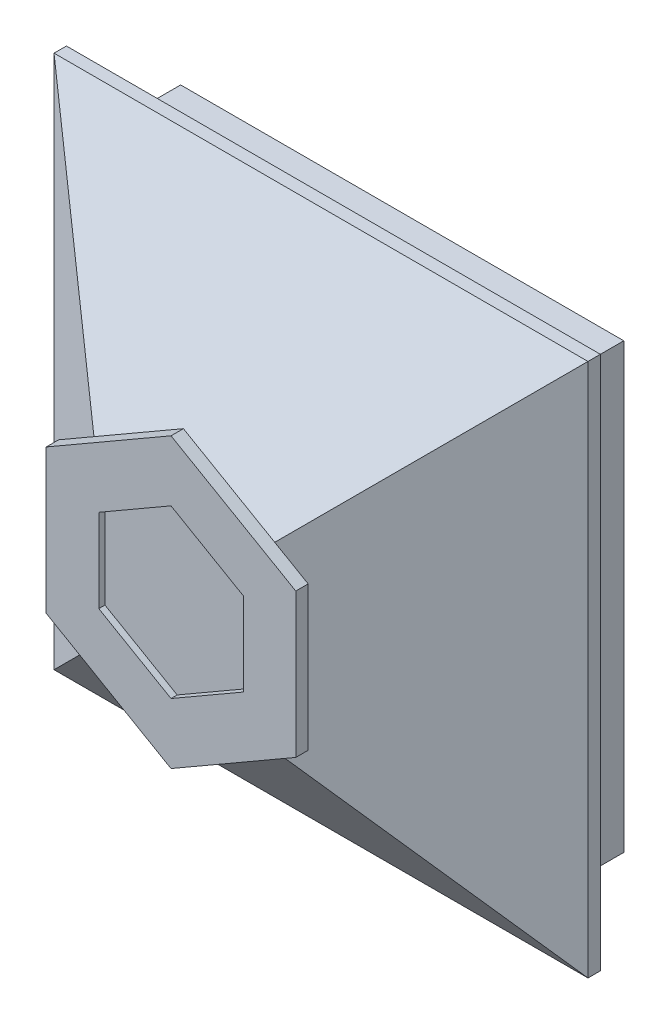
ISO-10303-21;
HEADER;
FILE_DESCRIPTION(('STEP AP214'),'2;1');
FILE_NAME('part.step','',(''),(''),'','','');
FILE_SCHEMA(('AUTOMOTIVE_DESIGN { 1 0 10303 214 1 1 1 1 }'));
ENDSEC;
DATA;
#1=APPLICATION_CONTEXT('core data for automotive mechanical design processes');
#2=APPLICATION_PROTOCOL_DEFINITION('international standard','automotive_design',2000,#1);
#3=PRODUCT_CONTEXT('',#1,'mechanical');
#4=PRODUCT('Part','Part','',(#3));
#5=PRODUCT_RELATED_PRODUCT_CATEGORY('part','',(#4));
#6=PRODUCT_DEFINITION_FORMATION('','',#4);
#7=PRODUCT_DEFINITION_CONTEXT('part definition',#1,'design');
#8=PRODUCT_DEFINITION('design','',#6,#7);
#9=PRODUCT_DEFINITION_SHAPE('','',#8);
#10=(LENGTH_UNIT() NAMED_UNIT(*) SI_UNIT(.MILLI.,.METRE.));
#11=(NAMED_UNIT(*) PLANE_ANGLE_UNIT() SI_UNIT($,.RADIAN.));
#12=(NAMED_UNIT(*) SI_UNIT($,.STERADIAN.) SOLID_ANGLE_UNIT());
#13=UNCERTAINTY_MEASURE_WITH_UNIT(LENGTH_MEASURE(1.E-05),#10,'distance_accuracy_value','');
#14=(GEOMETRIC_REPRESENTATION_CONTEXT(3) GLOBAL_UNCERTAINTY_ASSIGNED_CONTEXT((#13)) GLOBAL_UNIT_ASSIGNED_CONTEXT((#10,
#11,#12)) REPRESENTATION_CONTEXT('',''));
#15=CARTESIAN_POINT('',(0.,0.,0.));
#16=DIRECTION('',(0.,0.,1.));
#17=DIRECTION('',(1.,0.,0.));
#18=AXIS2_PLACEMENT_3D('',#15,#16,#17);
#19=CARTESIAN_POINT('',(0.,0.,31.8));
#20=DIRECTION('',(0.,0.,1.));
#21=DIRECTION('',(1.,0.,0.));
#22=AXIS2_PLACEMENT_3D('',#19,#20,#21);
#23=PLANE('',#22);
#24=DIRECTION('',(-0.866025403784441,0.499999999999995,0.));
#25=VECTOR('',#24,1.);
#26=CARTESIAN_POINT('',(-51.5011473021286,15.8638698337392,31.8));
#27=LINE('',#26,#25);
#28=CARTESIAN_POINT('',(-51.5011473021286,15.8638698337392,31.8));
#29=VERTEX_POINT('',#28);
#30=CARTESIAN_POINT('',(-69.6349675631671,26.3334358428859,31.8));
#31=VERTEX_POINT('',#30);
#32=EDGE_CURVE('E361',#29,#31,#27,.T.);
#33=ORIENTED_EDGE('',*,*,#32,.F.);
#34=DIRECTION('',(0.,1.,0.));
#35=VECTOR('',#34,1.);
#36=CARTESIAN_POINT('',(-51.5011473021284,-5.07526218455475,31.8));
#37=LINE('',#36,#35);
#38=CARTESIAN_POINT('',(-51.5011473021284,-5.07526218455475,31.8));
#39=VERTEX_POINT('',#38);
#40=EDGE_CURVE('E391',#39,#29,#37,.T.);
#41=ORIENTED_EDGE('',*,*,#40,.F.);
#42=DIRECTION('',(0.866025403784434,0.500000000000007,0.));
#43=VECTOR('',#42,1.);
#44=CARTESIAN_POINT('',(-69.634967563167,-15.5448281937019,31.8));
#45=LINE('',#44,#43);
#46=CARTESIAN_POINT('',(-69.634967563167,-15.5448281937019,31.8));
#47=VERTEX_POINT('',#46);
#48=EDGE_CURVE('E410',#47,#39,#45,.T.);
#49=ORIENTED_EDGE('',*,*,#48,.F.);
#50=DIRECTION('',(0.866025403784441,-0.499999999999995,0.));
#51=VECTOR('',#50,1.);
#52=CARTESIAN_POINT('',(-87.7687878242057,-5.075262184555,31.8));
#53=LINE('',#52,#51);
#54=CARTESIAN_POINT('',(-87.7687878242057,-5.075262184555,31.8));
#55=VERTEX_POINT('',#54);
#56=EDGE_CURVE('E408',#55,#47,#53,.T.);
#57=ORIENTED_EDGE('',*,*,#56,.F.);
#58=DIRECTION('',(0.,-1.,0.));
#59=VECTOR('',#58,1.);
#60=CARTESIAN_POINT('',(-87.7687878242058,15.8638698337389,31.8));
#61=LINE('',#60,#59);
#62=CARTESIAN_POINT('',(-87.7687878242058,15.8638698337389,31.8));
#63=VERTEX_POINT('',#62);
#64=EDGE_CURVE('E406',#63,#55,#61,.T.);
#65=ORIENTED_EDGE('',*,*,#64,.F.);
#66=DIRECTION('',(-0.866025403784438,-0.500000000000001,0.));
#67=VECTOR('',#66,1.);
#68=CARTESIAN_POINT('',(-69.6349675631671,26.3334358428859,31.8));
#69=LINE('',#68,#67);
#70=EDGE_CURVE('E404',#31,#63,#69,.T.);
#71=ORIENTED_EDGE('',*,*,#70,.F.);
#72=EDGE_LOOP('',(#33,#41,#49,#57,#65,#71));
#73=FACE_BOUND('',#72,.T.);
#74=DIRECTION('',(1.,0.,0.));
#75=VECTOR('',#74,1.);
#76=CARTESIAN_POINT('',(-108.434967563167,-7.53902950874128,31.8));
#77=LINE('',#76,#75);
#78=CARTESIAN_POINT('',(-82.5683008965004,-7.53902950874128,31.8));
#79=VERTEX_POINT('',#78);
#80=CARTESIAN_POINT('',(-56.7016342298339,-7.53902950874141,31.8));
#81=VERTEX_POINT('',#80);
#82=EDGE_CURVE('E440',#79,#81,#77,.T.);
#83=ORIENTED_EDGE('',*,*,#82,.T.);
#84=DIRECTION('',(0.,1.,0.));
#85=VECTOR('',#84,1.);
#86=CARTESIAN_POINT('',(-56.7016342298341,-33.4056961754081,31.8));
#87=LINE('',#86,#85);
#88=CARTESIAN_POINT('',(-56.7016342298336,18.3276371579253,31.8));
#89=VERTEX_POINT('',#88);
#90=EDGE_CURVE('E287',#81,#89,#87,.T.);
#91=ORIENTED_EDGE('',*,*,#90,.T.);
#92=DIRECTION('',(-1.,0.,0.));
#93=VECTOR('',#92,1.);
#94=CARTESIAN_POINT('',(-30.8349675631671,18.3276371579254,31.8));
#95=LINE('',#94,#93);
#96=CARTESIAN_POINT('',(-82.5683008965004,18.3276371579254,31.8));
#97=VERTEX_POINT('',#96);
#98=EDGE_CURVE('E316',#89,#97,#95,.T.);
#99=ORIENTED_EDGE('',*,*,#98,.T.);
#100=DIRECTION('',(0.,-1.,0.));
#101=VECTOR('',#100,1.);
#102=CARTESIAN_POINT('',(-82.5683008965003,44.1943038245921,31.8));
#103=LINE('',#102,#101);
#104=EDGE_CURVE('E353',#97,#79,#103,.T.);
#105=ORIENTED_EDGE('',*,*,#104,.T.);
#106=EDGE_LOOP('',(#83,#91,#99,#105));
#107=FACE_BOUND('',#106,.T.);
#108=ADVANCED_FACE('F33',(#73,#107),#23,.F.);
#109=CARTESIAN_POINT('',(-108.434967563167,-33.4056961754079,11.8));
#110=DIRECTION('',(0.,-0.611679591215394,0.791105604638577));
#111=DIRECTION('',(0.,-0.791105604638577,-0.611679591215394));
#112=AXIS2_PLACEMENT_3D('',#109,#110,#111);
#113=PLANE('',#112);
#114=ORIENTED_EDGE('',*,*,#82,.F.);
#115=DIRECTION('',(-0.620432415823373,-0.620432415823373,-0.479715785430443));
#116=VECTOR('',#115,1.);
#117=CARTESIAN_POINT('',(-108.434967563167,-33.4056961754079,11.8));
#118=LINE('',#117,#116);
#119=CARTESIAN_POINT('',(-108.434967563167,-33.4056961754079,11.8));
#120=VERTEX_POINT('',#119);
#121=EDGE_CURVE('E437',#79,#120,#118,.T.);
#122=ORIENTED_EDGE('',*,*,#121,.T.);
#123=DIRECTION('',(1.,0.,0.));
#124=VECTOR('',#123,1.);
#125=CARTESIAN_POINT('',(-108.434967563167,-33.4056961754079,11.8));
#126=LINE('',#125,#124);
#127=CARTESIAN_POINT('',(-30.8349675631675,-33.4056961754083,11.8));
#128=VERTEX_POINT('',#127);
#129=EDGE_CURVE('E448',#120,#128,#126,.T.);
#130=ORIENTED_EDGE('',*,*,#129,.T.);
#131=DIRECTION('',(-0.620432415823373,0.620432415823373,0.479715785430443));
#132=VECTOR('',#131,1.);
#133=CARTESIAN_POINT('',(-60.7060308532706,-3.53463288530443,34.8961829562656));
#134=LINE('',#133,#132);
#135=EDGE_CURVE('E433',#128,#81,#134,.T.);
#136=ORIENTED_EDGE('',*,*,#135,.T.);
#137=EDGE_LOOP('',(#114,#122,#130,#136));
#138=FACE_BOUND('',#137,.T.);
#139=ADVANCED_FACE('F509',(#138),#113,.T.);
#140=CARTESIAN_POINT('',(-108.434967563167,-30.4629790636216,11.8));
#141=DIRECTION('',(0.,0.611679591215394,-0.791105604638576));
#142=DIRECTION('',(0.,0.791105604638577,0.611679591215395));
#143=AXIS2_PLACEMENT_3D('',#140,#141,#142);
#144=PLANE('',#143);
#145=DIRECTION('',(1.,0.,0.));
#146=VECTOR('',#145,1.);
#147=CARTESIAN_POINT('',(-108.434967563167,-30.4629790636216,11.8));
#148=LINE('',#147,#146);
#149=CARTESIAN_POINT('',(-105.492250451381,-30.4629790636216,11.8));
#150=VERTEX_POINT('',#149);
#151=CARTESIAN_POINT('',(-33.7776846749538,-30.462979063622,11.8));
#152=VERTEX_POINT('',#151);
#153=EDGE_CURVE('E11',#150,#152,#148,.T.);
#154=ORIENTED_EDGE('',*,*,#153,.F.);
#155=DIRECTION('',(0.620432415823373,0.620432415823373,0.479715785430443));
#156=VECTOR('',#155,1.);
#157=CARTESIAN_POINT('',(-106.62500933142,-31.5957379436608,10.9241555051244));
#158=LINE('',#157,#156);
#159=CARTESIAN_POINT('',(-79.6255837847141,-4.59631239695497,31.8));
#160=VERTEX_POINT('',#159);
#161=EDGE_CURVE('E57',#150,#160,#158,.T.);
#162=ORIENTED_EDGE('',*,*,#161,.T.);
#163=DIRECTION('',(1.,0.,0.));
#164=VECTOR('',#163,1.);
#165=CARTESIAN_POINT('',(-108.434967563167,-4.59631239695497,31.8));
#166=LINE('',#165,#164);
#167=CARTESIAN_POINT('',(-59.6443513416202,-4.59631239695507,31.8));
#168=VERTEX_POINT('',#167);
#169=EDGE_CURVE('E439',#160,#168,#166,.T.);
#170=ORIENTED_EDGE('',*,*,#169,.T.);
#171=DIRECTION('',(0.620432415823373,-0.620432415823373,-0.479715785430443));
#172=VECTOR('',#171,1.);
#173=CARTESIAN_POINT('',(-62.5159890850177,-1.72467465355729,34.02033846139));
#174=LINE('',#173,#172);
#175=EDGE_CURVE('E430',#168,#152,#174,.T.);
#176=ORIENTED_EDGE('',*,*,#175,.T.);
#177=EDGE_LOOP('',(#154,#162,#170,#176));
#178=FACE_BOUND('',#177,.T.);
#179=ADVANCED_FACE('F516',(#178),#144,.T.);
#180=CARTESIAN_POINT('',(0.,0.,11.8));
#181=DIRECTION('',(0.,0.,1.));
#182=DIRECTION('',(1.,0.,0.));
#183=AXIS2_PLACEMENT_3D('',#180,#181,#182);
#184=PLANE('',#183);
#185=DIRECTION('',(0.,-1.,0.));
#186=VECTOR('',#185,1.);
#187=CARTESIAN_POINT('',(-39.2349675631674,-25.0056961754083,11.8));
#188=LINE('',#187,#186);
#189=CARTESIAN_POINT('',(-39.2349675631668,35.7943038245918,11.8));
#190=VERTEX_POINT('',#189);
#191=CARTESIAN_POINT('',(-39.2349675631674,-25.0056961754083,11.8));
#192=VERTEX_POINT('',#191);
#193=EDGE_CURVE('E297',#190,#192,#188,.T.);
#194=ORIENTED_EDGE('',*,*,#193,.T.);
#195=DIRECTION('',(-1.,0.,0.));
#196=VECTOR('',#195,1.);
#197=CARTESIAN_POINT('',(-100.034967563167,-25.0056961754079,11.8));
#198=LINE('',#197,#196);
#199=CARTESIAN_POINT('',(-100.034967563167,-25.0056961754079,11.8));
#200=VERTEX_POINT('',#199);
#201=EDGE_CURVE('E445',#192,#200,#198,.T.);
#202=ORIENTED_EDGE('',*,*,#201,.T.);
#203=DIRECTION('',(0.,1.,0.));
#204=VECTOR('',#203,1.);
#205=CARTESIAN_POINT('',(-100.034967563167,35.7943038245922,11.8));
#206=LINE('',#205,#204);
#207=CARTESIAN_POINT('',(-100.034967563167,35.7943038245921,11.8));
#208=VERTEX_POINT('',#207);
#209=EDGE_CURVE('E363',#200,#208,#206,.T.);
#210=ORIENTED_EDGE('',*,*,#209,.T.);
#211=DIRECTION('',(1.,0.,0.));
#212=VECTOR('',#211,1.);
#213=CARTESIAN_POINT('',(-39.2349675631671,35.7943038245921,11.8));
#214=LINE('',#213,#212);
#215=EDGE_CURVE('E326',#208,#190,#214,.T.);
#216=ORIENTED_EDGE('',*,*,#215,.T.);
#217=EDGE_LOOP('',(#194,#202,#210,#216));
#218=FACE_BOUND('',#217,.T.);
#219=ORIENTED_EDGE('',*,*,#153,.T.);
#220=DIRECTION('',(0.,1.,0.));
#221=VECTOR('',#220,1.);
#222=CARTESIAN_POINT('',(-33.7776846749538,-33.4056961754083,11.8));
#223=LINE('',#222,#221);
#224=CARTESIAN_POINT('',(-33.777684674953,41.2515867128054,11.8));
#225=VERTEX_POINT('',#224);
#226=EDGE_CURVE('E292',#152,#225,#223,.T.);
#227=ORIENTED_EDGE('',*,*,#226,.T.);
#228=DIRECTION('',(-1.,0.,0.));
#229=VECTOR('',#228,1.);
#230=CARTESIAN_POINT('',(-30.8349675631671,41.2515867128058,11.8));
#231=LINE('',#230,#229);
#232=CARTESIAN_POINT('',(-105.492250451381,41.2515867128058,11.8));
#233=VERTEX_POINT('',#232);
#234=EDGE_CURVE('E321',#225,#233,#231,.T.);
#235=ORIENTED_EDGE('',*,*,#234,.T.);
#236=DIRECTION('',(0.,-1.,0.));
#237=VECTOR('',#236,1.);
#238=CARTESIAN_POINT('',(-105.492250451381,44.1943038245922,11.8));
#239=LINE('',#238,#237);
#240=EDGE_CURVE('E358',#233,#150,#239,.T.);
#241=ORIENTED_EDGE('',*,*,#240,.T.);
#242=EDGE_LOOP('',(#219,#227,#235,#241));
#243=FACE_BOUND('',#242,.T.);
#244=ADVANCED_FACE('F542',(#218,#243),#184,.T.);
#245=CARTESIAN_POINT('',(0.,0.,0.));
#246=DIRECTION('',(0.,0.,1.));
#247=DIRECTION('',(1.,0.,0.));
#248=AXIS2_PLACEMENT_3D('',#245,#246,#247);
#249=PLANE('',#248);
#250=DIRECTION('',(0.,1.,0.));
#251=VECTOR('',#250,1.);
#252=CARTESIAN_POINT('',(-37.4349675631674,-26.8056961754083,0.));
#253=LINE('',#252,#251);
#254=CARTESIAN_POINT('',(-37.4349675631674,-26.8056961754083,0.));
#255=VERTEX_POINT('',#254);
#256=CARTESIAN_POINT('',(-37.4349675631668,37.5943038245917,0.));
#257=VERTEX_POINT('',#256);
#258=EDGE_CURVE('E306',#255,#257,#253,.T.);
#259=ORIENTED_EDGE('',*,*,#258,.F.);
#260=DIRECTION('',(1.,0.,0.));
#261=VECTOR('',#260,1.);
#262=CARTESIAN_POINT('',(-101.834967563167,-26.8056961754079,0.));
#263=LINE('',#262,#261);
#264=CARTESIAN_POINT('',(-101.834967563167,-26.8056961754079,0.));
#265=VERTEX_POINT('',#264);
#266=EDGE_CURVE('E466',#265,#255,#263,.T.);
#267=ORIENTED_EDGE('',*,*,#266,.F.);
#268=DIRECTION('',(0.,-1.,0.));
#269=VECTOR('',#268,1.);
#270=CARTESIAN_POINT('',(-101.834967563167,37.5943038245922,0.));
#271=LINE('',#270,#269);
#272=CARTESIAN_POINT('',(-101.834967563167,37.594303824592,0.));
#273=VERTEX_POINT('',#272);
#274=EDGE_CURVE('E379',#273,#265,#271,.T.);
#275=ORIENTED_EDGE('',*,*,#274,.F.);
#276=DIRECTION('',(-1.,0.,0.));
#277=VECTOR('',#276,1.);
#278=CARTESIAN_POINT('',(-37.4349675631671,37.5943038245921,0.));
#279=LINE('',#278,#277);
#280=EDGE_CURVE('E340',#257,#273,#279,.T.);
#281=ORIENTED_EDGE('',*,*,#280,.F.);
#282=EDGE_LOOP('',(#259,#267,#275,#281));
#283=FACE_BOUND('',#282,.T.);
#284=DIRECTION('',(1.,0.,0.));
#285=VECTOR('',#284,1.);
#286=CARTESIAN_POINT('',(-100.034967563167,-25.0056961754079,0.));
#287=LINE('',#286,#285);
#288=CARTESIAN_POINT('',(-100.034967563167,-25.0056961754079,0.));
#289=VERTEX_POINT('',#288);
#290=CARTESIAN_POINT('',(-39.2349675631674,-25.0056961754083,0.));
#291=VERTEX_POINT('',#290);
#292=EDGE_CURVE('E457',#289,#291,#287,.T.);
#293=ORIENTED_EDGE('',*,*,#292,.T.);
#294=DIRECTION('',(0.,1.,0.));
#295=VECTOR('',#294,1.);
#296=CARTESIAN_POINT('',(-39.2349675631674,-25.0056961754082,0.));
#297=LINE('',#296,#295);
#298=CARTESIAN_POINT('',(-39.2349675631668,35.7943038245918,0.));
#299=VERTEX_POINT('',#298);
#300=EDGE_CURVE('E302',#291,#299,#297,.T.);
#301=ORIENTED_EDGE('',*,*,#300,.T.);
#302=DIRECTION('',(-1.,0.,0.));
#303=VECTOR('',#302,1.);
#304=CARTESIAN_POINT('',(-39.2349675631671,35.7943038245921,0.));
#305=LINE('',#304,#303);
#306=CARTESIAN_POINT('',(-100.034967563167,35.7943038245921,0.));
#307=VERTEX_POINT('',#306);
#308=EDGE_CURVE('E335',#299,#307,#305,.T.);
#309=ORIENTED_EDGE('',*,*,#308,.T.);
#310=DIRECTION('',(0.,-1.,0.));
#311=VECTOR('',#310,1.);
#312=CARTESIAN_POINT('',(-100.034967563167,35.7943038245922,0.));
#313=LINE('',#312,#311);
#314=EDGE_CURVE('E374',#307,#289,#313,.T.);
#315=ORIENTED_EDGE('',*,*,#314,.T.);
#316=EDGE_LOOP('',(#293,#301,#309,#315));
#317=FACE_BOUND('',#316,.T.);
#318=ADVANCED_FACE('F484',(#283,#317),#249,.F.);
#319=CARTESIAN_POINT('',(-101.834967563167,-26.8056961754079,10.));
#320=DIRECTION('',(0.,1.,0.));
#321=DIRECTION('',(0.,0.,1.));
#322=AXIS2_PLACEMENT_3D('',#319,#320,#321);
#323=PLANE('',#322);
#324=ORIENTED_EDGE('',*,*,#266,.T.);
#325=DIRECTION('',(0.,0.,-1.));
#326=VECTOR('',#325,1.);
#327=CARTESIAN_POINT('',(-37.4349675631671,-26.8056961754079,10.));
#328=LINE('',#327,#326);
#329=CARTESIAN_POINT('',(-37.4349675631674,-26.8056961754083,10.));
#330=VERTEX_POINT('',#329);
#331=EDGE_CURVE('E470',#330,#255,#328,.T.);
#332=ORIENTED_EDGE('',*,*,#331,.F.);
#333=DIRECTION('',(1.,0.,0.));
#334=VECTOR('',#333,1.);
#335=CARTESIAN_POINT('',(-101.834967563167,-26.8056961754079,10.));
#336=LINE('',#335,#334);
#337=CARTESIAN_POINT('',(-101.834967563167,-26.8056961754079,10.));
#338=VERTEX_POINT('',#337);
#339=EDGE_CURVE('E467',#338,#330,#336,.T.);
#340=ORIENTED_EDGE('',*,*,#339,.F.);
#341=DIRECTION('',(0.,0.,-1.));
#342=VECTOR('',#341,1.);
#343=CARTESIAN_POINT('',(-101.834967563167,-26.8056961754079,10.));
#344=LINE('',#343,#342);
#345=EDGE_CURVE('E37',#338,#265,#344,.T.);
#346=ORIENTED_EDGE('',*,*,#345,.T.);
#347=EDGE_LOOP('',(#324,#332,#340,#346));
#348=FACE_BOUND('',#347,.T.);
#349=ADVANCED_FACE('F35',(#348),#323,.F.);
#350=CARTESIAN_POINT('',(-100.034967563167,-25.0056961754079,10.));
#351=DIRECTION('',(0.,1.,0.));
#352=DIRECTION('',(0.,0.,1.));
#353=AXIS2_PLACEMENT_3D('',#350,#351,#352);
#354=PLANE('',#353);
#355=ORIENTED_EDGE('',*,*,#292,.F.);
#356=DIRECTION('',(0.,0.,-1.));
#357=VECTOR('',#356,1.);
#358=CARTESIAN_POINT('',(-100.034967563167,-25.0056961754079,10.));
#359=LINE('',#358,#357);
#360=EDGE_CURVE('E463',#200,#289,#359,.T.);
#361=ORIENTED_EDGE('',*,*,#360,.F.);
#362=ORIENTED_EDGE('',*,*,#201,.F.);
#363=DIRECTION('',(0.,0.,-1.));
#364=VECTOR('',#363,1.);
#365=CARTESIAN_POINT('',(-39.2349675631671,-25.0056961754079,10.));
#366=LINE('',#365,#364);
#367=EDGE_CURVE('E460',#192,#291,#366,.T.);
#368=ORIENTED_EDGE('',*,*,#367,.T.);
#369=EDGE_LOOP('',(#355,#361,#362,#368));
#370=FACE_BOUND('',#369,.T.);
#371=ADVANCED_FACE('F569',(#370),#354,.T.);
#372=CARTESIAN_POINT('',(0.,0.,10.));
#373=DIRECTION('',(0.,0.,1.));
#374=DIRECTION('',(1.,0.,0.));
#375=AXIS2_PLACEMENT_3D('',#372,#373,#374);
#376=PLANE('',#375);
#377=ORIENTED_EDGE('',*,*,#339,.T.);
#378=DIRECTION('',(0.,1.,0.));
#379=VECTOR('',#378,1.);
#380=CARTESIAN_POINT('',(-37.4349675631674,-26.8056961754083,10.));
#381=LINE('',#380,#379);
#382=CARTESIAN_POINT('',(-37.4349675631668,37.5943038245917,10.));
#383=VERTEX_POINT('',#382);
#384=EDGE_CURVE('E296',#330,#383,#381,.T.);
#385=ORIENTED_EDGE('',*,*,#384,.T.);
#386=DIRECTION('',(-1.,0.,0.));
#387=VECTOR('',#386,1.);
#388=CARTESIAN_POINT('',(-37.4349675631671,37.5943038245921,10.));
#389=LINE('',#388,#387);
#390=CARTESIAN_POINT('',(-101.834967563167,37.5943038245921,10.));
#391=VERTEX_POINT('',#390);
#392=EDGE_CURVE('E341',#383,#391,#389,.T.);
#393=ORIENTED_EDGE('',*,*,#392,.T.);
#394=DIRECTION('',(0.,-1.,0.));
#395=VECTOR('',#394,1.);
#396=CARTESIAN_POINT('',(-101.834967563167,37.5943038245922,10.));
#397=LINE('',#396,#395);
#398=EDGE_CURVE('E380',#391,#338,#397,.T.);
#399=ORIENTED_EDGE('',*,*,#398,.T.);
#400=EDGE_LOOP('',(#377,#385,#393,#399));
#401=FACE_BOUND('',#400,.T.);
#402=DIRECTION('',(1.,0.,0.));
#403=VECTOR('',#402,1.);
#404=CARTESIAN_POINT('',(-108.434967563167,-33.4056961754079,10.));
#405=LINE('',#404,#403);
#406=CARTESIAN_POINT('',(-108.434967563167,-33.4056961754079,10.));
#407=VERTEX_POINT('',#406);
#408=CARTESIAN_POINT('',(-30.8349675631675,-33.4056961754083,10.));
#409=VERTEX_POINT('',#408);
#410=EDGE_CURVE('E443',#407,#409,#405,.T.);
#411=ORIENTED_EDGE('',*,*,#410,.F.);
#412=DIRECTION('',(0.,-1.,0.));
#413=VECTOR('',#412,1.);
#414=CARTESIAN_POINT('',(-108.434967563167,44.1943038245922,10.));
#415=LINE('',#414,#413);
#416=CARTESIAN_POINT('',(-108.434967563167,44.1943038245922,10.));
#417=VERTEX_POINT('',#416);
#418=EDGE_CURVE('E355',#417,#407,#415,.T.);
#419=ORIENTED_EDGE('',*,*,#418,.F.);
#420=DIRECTION('',(-1.,0.,0.));
#421=VECTOR('',#420,1.);
#422=CARTESIAN_POINT('',(-30.8349675631671,44.1943038245921,10.));
#423=LINE('',#422,#421);
#424=CARTESIAN_POINT('',(-30.8349675631671,44.1943038245921,10.));
#425=VERTEX_POINT('',#424);
#426=EDGE_CURVE('E319',#425,#417,#423,.T.);
#427=ORIENTED_EDGE('',*,*,#426,.F.);
#428=DIRECTION('',(0.,1.,0.));
#429=VECTOR('',#428,1.);
#430=CARTESIAN_POINT('',(-30.8349675631675,-33.4056961754083,10.));
#431=LINE('',#430,#429);
#432=EDGE_CURVE('E290',#409,#425,#431,.T.);
#433=ORIENTED_EDGE('',*,*,#432,.F.);
#434=EDGE_LOOP('',(#411,#419,#427,#433));
#435=FACE_BOUND('',#434,.T.);
#436=ADVANCED_FACE('F490',(#401,#435),#376,.F.);
#437=CARTESIAN_POINT('',(-108.434967563167,-33.4056961754079,11.8));
#438=DIRECTION('',(0.,1.,0.));
#439=DIRECTION('',(0.,0.,1.));
#440=AXIS2_PLACEMENT_3D('',#437,#438,#439);
#441=PLANE('',#440);
#442=ORIENTED_EDGE('',*,*,#410,.T.);
#443=DIRECTION('',(0.,0.,-1.));
#444=VECTOR('',#443,1.);
#445=CARTESIAN_POINT('',(-30.8349675631671,-33.4056961754079,11.8));
#446=LINE('',#445,#444);
#447=EDGE_CURVE('E451',#128,#409,#446,.T.);
#448=ORIENTED_EDGE('',*,*,#447,.F.);
#449=ORIENTED_EDGE('',*,*,#129,.F.);
#450=DIRECTION('',(0.,0.,-1.));
#451=VECTOR('',#450,1.);
#452=CARTESIAN_POINT('',(-108.434967563167,-33.4056961754079,11.8));
#453=LINE('',#452,#451);
#454=EDGE_CURVE('E455',#120,#407,#453,.T.);
#455=ORIENTED_EDGE('',*,*,#454,.T.);
#456=EDGE_LOOP('',(#442,#448,#449,#455));
#457=FACE_BOUND('',#456,.T.);
#458=ADVANCED_FACE('F606',(#457),#441,.F.);
#459=CARTESIAN_POINT('',(-51.5011473021286,15.8638698337392,33.6));
#460=DIRECTION('',(-0.499999999999995,-0.866025403784441,0.));
#461=DIRECTION('',(0.866025403784442,-0.499999999999995,0.));
#462=AXIS2_PLACEMENT_3D('',#459,#460,#461);
#463=PLANE('',#462);
#464=ORIENTED_EDGE('',*,*,#32,.T.);
#465=DIRECTION('',(0.,0.,-1.));
#466=VECTOR('',#465,1.);
#467=CARTESIAN_POINT('',(-69.6349675631671,26.3334358428859,33.6));
#468=LINE('',#467,#466);
#469=CARTESIAN_POINT('',(-69.6349675631671,26.3334358428859,33.6));
#470=VERTEX_POINT('',#469);
#471=EDGE_CURVE('E427',#470,#31,#468,.T.);
#472=ORIENTED_EDGE('',*,*,#471,.F.);
#473=DIRECTION('',(-0.866025403784441,0.499999999999995,0.));
#474=VECTOR('',#473,1.);
#475=CARTESIAN_POINT('',(-51.5011473021286,15.8638698337392,33.6));
#476=LINE('',#475,#474);
#477=CARTESIAN_POINT('',(-51.5011473021286,15.8638698337392,33.6));
#478=VERTEX_POINT('',#477);
#479=EDGE_CURVE('E387',#478,#470,#476,.T.);
#480=ORIENTED_EDGE('',*,*,#479,.F.);
#481=DIRECTION('',(0.,0.,-1.));
#482=VECTOR('',#481,1.);
#483=CARTESIAN_POINT('',(-51.5011473021286,15.8638698337392,33.6));
#484=LINE('',#483,#482);
#485=EDGE_CURVE('E401',#478,#29,#484,.T.);
#486=ORIENTED_EDGE('',*,*,#485,.T.);
#487=EDGE_LOOP('',(#464,#472,#480,#486));
#488=FACE_BOUND('',#487,.T.);
#489=ADVANCED_FACE('F614',(#488),#463,.F.);
#490=CARTESIAN_POINT('',(-69.6349675631671,26.3334358428859,33.6));
#491=DIRECTION('',(0.500000000000001,-0.866025403784438,0.));
#492=DIRECTION('',(0.866025403784438,0.500000000000001,0.));
#493=AXIS2_PLACEMENT_3D('',#490,#491,#492);
#494=PLANE('',#493);
#495=ORIENTED_EDGE('',*,*,#70,.T.);
#496=DIRECTION('',(0.,0.,-1.));
#497=VECTOR('',#496,1.);
#498=CARTESIAN_POINT('',(-87.7687878242058,15.8638698337389,33.6));
#499=LINE('',#498,#497);
#500=CARTESIAN_POINT('',(-87.7687878242058,15.8638698337389,33.6));
#501=VERTEX_POINT('',#500);
#502=EDGE_CURVE('E424',#501,#63,#499,.T.);
#503=ORIENTED_EDGE('',*,*,#502,.F.);
#504=DIRECTION('',(-0.866025403784438,-0.500000000000001,0.));
#505=VECTOR('',#504,1.);
#506=CARTESIAN_POINT('',(-69.6349675631671,26.3334358428859,33.6));
#507=LINE('',#506,#505);
#508=EDGE_CURVE('E390',#470,#501,#507,.T.);
#509=ORIENTED_EDGE('',*,*,#508,.F.);
#510=ORIENTED_EDGE('',*,*,#471,.T.);
#511=EDGE_LOOP('',(#495,#503,#509,#510));
#512=FACE_BOUND('',#511,.T.);
#513=ADVANCED_FACE('F620',(#512),#494,.F.);
#514=CARTESIAN_POINT('',(-87.7687878242058,15.8638698337389,33.6));
#515=DIRECTION('',(1.,0.,0.));
#516=DIRECTION('',(0.,1.,0.));
#517=AXIS2_PLACEMENT_3D('',#514,#515,#516);
#518=PLANE('',#517);
#519=ORIENTED_EDGE('',*,*,#64,.T.);
#520=DIRECTION('',(0.,0.,-1.));
#521=VECTOR('',#520,1.);
#522=CARTESIAN_POINT('',(-87.7687878242057,-5.075262184555,33.6));
#523=LINE('',#522,#521);
#524=CARTESIAN_POINT('',(-87.7687878242057,-5.075262184555,33.6));
#525=VERTEX_POINT('',#524);
#526=EDGE_CURVE('E421',#525,#55,#523,.T.);
#527=ORIENTED_EDGE('',*,*,#526,.F.);
#528=DIRECTION('',(0.,-1.,0.));
#529=VECTOR('',#528,1.);
#530=CARTESIAN_POINT('',(-87.7687878242058,15.8638698337389,33.6));
#531=LINE('',#530,#529);
#532=EDGE_CURVE('E393',#501,#525,#531,.T.);
#533=ORIENTED_EDGE('',*,*,#532,.F.);
#534=ORIENTED_EDGE('',*,*,#502,.T.);
#535=EDGE_LOOP('',(#519,#527,#533,#534));
#536=FACE_BOUND('',#535,.T.);
#537=ADVANCED_FACE('F639',(#536),#518,.F.);
#538=CARTESIAN_POINT('',(-87.7687878242057,-5.075262184555,33.6));
#539=DIRECTION('',(0.499999999999995,0.866025403784442,0.));
#540=DIRECTION('',(-0.866025403784442,0.499999999999995,0.));
#541=AXIS2_PLACEMENT_3D('',#538,#539,#540);
#542=PLANE('',#541);
#543=ORIENTED_EDGE('',*,*,#56,.T.);
#544=DIRECTION('',(0.,0.,-1.));
#545=VECTOR('',#544,1.);
#546=CARTESIAN_POINT('',(-69.634967563167,-15.5448281937019,33.6));
#547=LINE('',#546,#545);
#548=CARTESIAN_POINT('',(-69.634967563167,-15.5448281937019,33.6));
#549=VERTEX_POINT('',#548);
#550=EDGE_CURVE('E418',#549,#47,#547,.T.);
#551=ORIENTED_EDGE('',*,*,#550,.F.);
#552=DIRECTION('',(0.866025403784441,-0.499999999999995,0.));
#553=VECTOR('',#552,1.);
#554=CARTESIAN_POINT('',(-87.7687878242057,-5.075262184555,33.6));
#555=LINE('',#554,#553);
#556=EDGE_CURVE('E395',#525,#549,#555,.T.);
#557=ORIENTED_EDGE('',*,*,#556,.F.);
#558=ORIENTED_EDGE('',*,*,#526,.T.);
#559=EDGE_LOOP('',(#543,#551,#557,#558));
#560=FACE_BOUND('',#559,.T.);
#561=ADVANCED_FACE('F643',(#560),#542,.F.);
#562=CARTESIAN_POINT('',(-69.634967563167,-15.5448281937019,33.6));
#563=DIRECTION('',(-0.500000000000007,0.866025403784434,0.));
#564=DIRECTION('',(-0.866025403784434,-0.500000000000007,0.));
#565=AXIS2_PLACEMENT_3D('',#562,#563,#564);
#566=PLANE('',#565);
#567=ORIENTED_EDGE('',*,*,#48,.T.);
#568=DIRECTION('',(0.,0.,-1.));
#569=VECTOR('',#568,1.);
#570=CARTESIAN_POINT('',(-51.5011473021284,-5.07526218455475,33.6));
#571=LINE('',#570,#569);
#572=CARTESIAN_POINT('',(-51.5011473021284,-5.07526218455475,33.6));
#573=VERTEX_POINT('',#572);
#574=EDGE_CURVE('E415',#573,#39,#571,.T.);
#575=ORIENTED_EDGE('',*,*,#574,.F.);
#576=DIRECTION('',(0.866025403784434,0.500000000000007,0.));
#577=VECTOR('',#576,1.);
#578=CARTESIAN_POINT('',(-69.634967563167,-15.5448281937019,33.6));
#579=LINE('',#578,#577);
#580=EDGE_CURVE('E397',#549,#573,#579,.T.);
#581=ORIENTED_EDGE('',*,*,#580,.F.);
#582=ORIENTED_EDGE('',*,*,#550,.T.);
#583=EDGE_LOOP('',(#567,#575,#581,#582));
#584=FACE_BOUND('',#583,.T.);
#585=ADVANCED_FACE('F647',(#584),#566,.F.);
#586=CARTESIAN_POINT('',(-51.5011473021284,-5.07526218455475,33.6));
#587=DIRECTION('',(-1.,0.,0.));
#588=DIRECTION('',(0.,-1.,0.));
#589=AXIS2_PLACEMENT_3D('',#586,#587,#588);
#590=PLANE('',#589);
#591=ORIENTED_EDGE('',*,*,#40,.T.);
#592=ORIENTED_EDGE('',*,*,#485,.F.);
#593=DIRECTION('',(0.,1.,0.));
#594=VECTOR('',#593,1.);
#595=CARTESIAN_POINT('',(-51.5011473021284,-5.07526218455475,33.6));
#596=LINE('',#595,#594);
#597=EDGE_CURVE('E399',#573,#478,#596,.T.);
#598=ORIENTED_EDGE('',*,*,#597,.F.);
#599=ORIENTED_EDGE('',*,*,#574,.T.);
#600=EDGE_LOOP('',(#591,#592,#598,#599));
#601=FACE_BOUND('',#600,.T.);
#602=ADVANCED_FACE('F533',(#601),#590,.F.);
#603=CARTESIAN_POINT('',(0.,0.,33.6));
#604=DIRECTION('',(0.,0.,1.));
#605=DIRECTION('',(1.,0.,0.));
#606=AXIS2_PLACEMENT_3D('',#603,#604,#605);
#607=PLANE('',#606);
#608=DIRECTION('',(-0.866025403784439,0.5,0.));
#609=VECTOR('',#608,1.);
#610=CARTESIAN_POINT('',(-59.134967563167,11.4564816510833,33.6));
#611=LINE('',#610,#609);
#612=CARTESIAN_POINT('',(-59.134967563167,11.4564816510833,33.6));
#613=VERTEX_POINT('',#612);
#614=CARTESIAN_POINT('',(-69.634967563167,17.5186594775743,33.6));
#615=VERTEX_POINT('',#614);
#616=EDGE_CURVE('E49',#613,#615,#611,.T.);
#617=ORIENTED_EDGE('',*,*,#616,.F.);
#618=DIRECTION('',(0.,1.,0.));
#619=VECTOR('',#618,1.);
#620=CARTESIAN_POINT('',(-59.134967563167,-0.667874001898876,33.6));
#621=LINE('',#620,#619);
#622=CARTESIAN_POINT('',(-59.134967563167,-0.667874001898876,33.6));
#623=VERTEX_POINT('',#622);
#624=EDGE_CURVE('E253',#623,#613,#621,.T.);
#625=ORIENTED_EDGE('',*,*,#624,.F.);
#626=DIRECTION('',(0.866025403784439,0.5,0.));
#627=VECTOR('',#626,1.);
#628=CARTESIAN_POINT('',(-69.634967563167,-6.73005182838994,33.6));
#629=LINE('',#628,#627);
#630=CARTESIAN_POINT('',(-69.634967563167,-6.73005182838994,33.6));
#631=VERTEX_POINT('',#630);
#632=EDGE_CURVE('E256',#631,#623,#629,.T.);
#633=ORIENTED_EDGE('',*,*,#632,.F.);
#634=DIRECTION('',(0.866025403784439,-0.5,0.));
#635=VECTOR('',#634,1.);
#636=CARTESIAN_POINT('',(-80.134967563167,-0.667874001898868,33.6));
#637=LINE('',#636,#635);
#638=CARTESIAN_POINT('',(-80.134967563167,-0.667874001898868,33.6));
#639=VERTEX_POINT('',#638);
#640=EDGE_CURVE('E272',#639,#631,#637,.T.);
#641=ORIENTED_EDGE('',*,*,#640,.F.);
#642=DIRECTION('',(0.,-1.,0.));
#643=VECTOR('',#642,1.);
#644=CARTESIAN_POINT('',(-80.134967563167,11.4564816510833,33.6));
#645=LINE('',#644,#643);
#646=CARTESIAN_POINT('',(-80.134967563167,11.4564816510833,33.6));
#647=VERTEX_POINT('',#646);
#648=EDGE_CURVE('E269',#647,#639,#645,.T.);
#649=ORIENTED_EDGE('',*,*,#648,.F.);
#650=DIRECTION('',(-0.866025403784439,-0.5,0.));
#651=VECTOR('',#650,1.);
#652=CARTESIAN_POINT('',(-69.634967563167,17.5186594775743,33.6));
#653=LINE('',#652,#651);
#654=EDGE_CURVE('E267',#615,#647,#653,.T.);
#655=ORIENTED_EDGE('',*,*,#654,.F.);
#656=EDGE_LOOP('',(#617,#625,#633,#641,#649,#655));
#657=FACE_BOUND('',#656,.T.);
#658=ORIENTED_EDGE('',*,*,#479,.T.);
#659=ORIENTED_EDGE('',*,*,#508,.T.);
#660=ORIENTED_EDGE('',*,*,#532,.T.);
#661=ORIENTED_EDGE('',*,*,#556,.T.);
#662=ORIENTED_EDGE('',*,*,#580,.T.);
#663=ORIENTED_EDGE('',*,*,#597,.T.);
#664=EDGE_LOOP('',(#658,#659,#660,#661,#662,#663));
#665=FACE_BOUND('',#664,.T.);
#666=ADVANCED_FACE('F525',(#657,#665),#607,.T.);
#667=DIRECTION('',(-1.,0.,0.));
#668=VECTOR('',#667,1.);
#669=CARTESIAN_POINT('',(-30.8349675631671,15.3849200461391,31.8));
#670=LINE('',#669,#668);
#671=CARTESIAN_POINT('',(-59.64435134162,15.384920046139,31.8));
#672=VERTEX_POINT('',#671);
#673=CARTESIAN_POINT('',(-79.6255837847141,15.3849200461391,31.8));
#674=VERTEX_POINT('',#673);
#675=EDGE_CURVE('E315',#672,#674,#670,.T.);
#676=ORIENTED_EDGE('',*,*,#675,.F.);
#677=DIRECTION('',(0.,1.,0.));
#678=VECTOR('',#677,1.);
#679=CARTESIAN_POINT('',(-59.6443513416204,-33.405696175408,31.8));
#680=LINE('',#679,#678);
#681=EDGE_CURVE('E279',#168,#672,#680,.T.);
#682=ORIENTED_EDGE('',*,*,#681,.F.);
#683=ORIENTED_EDGE('',*,*,#169,.F.);
#684=DIRECTION('',(0.,-1.,0.));
#685=VECTOR('',#684,1.);
#686=CARTESIAN_POINT('',(-79.625583784714,44.1943038245921,31.8));
#687=LINE('',#686,#685);
#688=EDGE_CURVE('E352',#674,#160,#687,.T.);
#689=ORIENTED_EDGE('',*,*,#688,.F.);
#690=EDGE_LOOP('',(#676,#682,#683,#689));
#691=FACE_BOUND('',#690,.T.);
#692=ADVANCED_FACE('F512',(#691),#23,.F.);
#693=CARTESIAN_POINT('',(-108.434967563167,44.1943038245922,11.8));
#694=DIRECTION('',(-0.611679591215394,0.,0.791105604638577));
#695=DIRECTION('',(-0.791105604638577,0.,-0.611679591215394));
#696=AXIS2_PLACEMENT_3D('',#693,#694,#695);
#697=PLANE('',#696);
#698=ORIENTED_EDGE('',*,*,#104,.F.);
#699=DIRECTION('',(-0.620432415823371,0.620432415823375,-0.479715785430443));
#700=VECTOR('',#699,1.);
#701=CARTESIAN_POINT('',(-108.434967563167,44.1943038245922,11.8));
#702=LINE('',#701,#700);
#703=CARTESIAN_POINT('',(-108.434967563167,44.1943038245921,11.8));
#704=VERTEX_POINT('',#703);
#705=EDGE_CURVE('E349',#97,#704,#702,.T.);
#706=ORIENTED_EDGE('',*,*,#705,.T.);
#707=DIRECTION('',(0.,-1.,0.));
#708=VECTOR('',#707,1.);
#709=CARTESIAN_POINT('',(-108.434967563167,44.1943038245922,11.8));
#710=LINE('',#709,#708);
#711=EDGE_CURVE('E366',#704,#120,#710,.T.);
#712=ORIENTED_EDGE('',*,*,#711,.T.);
#713=ORIENTED_EDGE('',*,*,#121,.F.);
#714=EDGE_LOOP('',(#698,#706,#712,#713));
#715=FACE_BOUND('',#714,.T.);
#716=ADVANCED_FACE('F524',(#715),#697,.T.);
#717=CARTESIAN_POINT('',(-105.492250451381,44.1943038245922,11.8));
#718=DIRECTION('',(0.611679591215394,0.,-0.791105604638576));
#719=DIRECTION('',(0.791105604638577,0.,0.611679591215395));
#720=AXIS2_PLACEMENT_3D('',#717,#718,#719);
#721=PLANE('',#720);
#722=ORIENTED_EDGE('',*,*,#240,.F.);
#723=DIRECTION('',(0.62043241582337,-0.620432415823375,0.479715785430443));
#724=VECTOR('',#723,1.);
#725=CARTESIAN_POINT('',(-106.62500933142,42.3843455928451,10.9241555051244));
#726=LINE('',#725,#724);
#727=EDGE_CURVE('E324',#233,#674,#726,.T.);
#728=ORIENTED_EDGE('',*,*,#727,.T.);
#729=ORIENTED_EDGE('',*,*,#688,.T.);
#730=ORIENTED_EDGE('',*,*,#161,.F.);
#731=EDGE_LOOP('',(#722,#728,#729,#730));
#732=FACE_BOUND('',#731,.T.);
#733=ADVANCED_FACE('F531',(#732),#721,.T.);
#734=CARTESIAN_POINT('',(-101.834967563167,37.5943038245922,10.));
#735=DIRECTION('',(1.,0.,0.));
#736=DIRECTION('',(0.,0.,1.));
#737=AXIS2_PLACEMENT_3D('',#734,#735,#736);
#738=PLANE('',#737);
#739=ORIENTED_EDGE('',*,*,#274,.T.);
#740=ORIENTED_EDGE('',*,*,#345,.F.);
#741=ORIENTED_EDGE('',*,*,#398,.F.);
#742=DIRECTION('',(0.,0.,-1.));
#743=VECTOR('',#742,1.);
#744=CARTESIAN_POINT('',(-101.834967563167,37.5943038245922,10.));
#745=LINE('',#744,#743);
#746=EDGE_CURVE('E362',#391,#273,#745,.T.);
#747=ORIENTED_EDGE('',*,*,#746,.T.);
#748=EDGE_LOOP('',(#739,#740,#741,#747));
#749=FACE_BOUND('',#748,.T.);
#750=ADVANCED_FACE('F481',(#749),#738,.F.);
#751=CARTESIAN_POINT('',(-100.034967563167,35.7943038245922,10.));
#752=DIRECTION('',(1.,0.,0.));
#753=DIRECTION('',(0.,0.,1.));
#754=AXIS2_PLACEMENT_3D('',#751,#752,#753);
#755=PLANE('',#754);
#756=ORIENTED_EDGE('',*,*,#314,.F.);
#757=DIRECTION('',(0.,0.,-1.));
#758=VECTOR('',#757,1.);
#759=CARTESIAN_POINT('',(-100.034967563167,35.7943038245922,10.));
#760=LINE('',#759,#758);
#761=EDGE_CURVE('E377',#208,#307,#760,.T.);
#762=ORIENTED_EDGE('',*,*,#761,.F.);
#763=ORIENTED_EDGE('',*,*,#209,.F.);
#764=ORIENTED_EDGE('',*,*,#360,.T.);
#765=EDGE_LOOP('',(#756,#762,#763,#764));
#766=FACE_BOUND('',#765,.T.);
#767=ADVANCED_FACE('F550',(#766),#755,.T.);
#768=CARTESIAN_POINT('',(-108.434967563167,44.1943038245922,11.8));
#769=DIRECTION('',(1.,0.,0.));
#770=DIRECTION('',(0.,0.,1.));
#771=AXIS2_PLACEMENT_3D('',#768,#769,#770);
#772=PLANE('',#771);
#773=ORIENTED_EDGE('',*,*,#418,.T.);
#774=ORIENTED_EDGE('',*,*,#454,.F.);
#775=ORIENTED_EDGE('',*,*,#711,.F.);
#776=DIRECTION('',(0.,0.,-1.));
#777=VECTOR('',#776,1.);
#778=CARTESIAN_POINT('',(-108.434967563167,44.1943038245922,11.8));
#779=LINE('',#778,#777);
#780=EDGE_CURVE('E369',#704,#417,#779,.T.);
#781=ORIENTED_EDGE('',*,*,#780,.T.);
#782=EDGE_LOOP('',(#773,#774,#775,#781));
#783=FACE_BOUND('',#782,.T.);
#784=ADVANCED_FACE('F553',(#783),#772,.F.);
#785=CARTESIAN_POINT('',(-30.8349675631671,44.1943038245921,11.8));
#786=DIRECTION('',(0.,0.611679591215394,0.791105604638577));
#787=DIRECTION('',(0.,0.791105604638577,-0.611679591215394));
#788=AXIS2_PLACEMENT_3D('',#785,#786,#787);
#789=PLANE('',#788);
#790=ORIENTED_EDGE('',*,*,#98,.F.);
#791=DIRECTION('',(0.620432415823373,0.620432415823373,-0.479715785430443));
#792=VECTOR('',#791,1.);
#793=CARTESIAN_POINT('',(-30.8349675631671,44.1943038245921,11.8));
#794=LINE('',#793,#792);
#795=CARTESIAN_POINT('',(-30.8349675631667,44.1943038245917,11.8));
#796=VERTEX_POINT('',#795);
#797=EDGE_CURVE('E312',#89,#796,#794,.T.);
#798=ORIENTED_EDGE('',*,*,#797,.T.);
#799=DIRECTION('',(-1.,0.,0.));
#800=VECTOR('',#799,1.);
#801=CARTESIAN_POINT('',(-30.8349675631671,44.1943038245921,11.8));
#802=LINE('',#801,#800);
#803=EDGE_CURVE('E329',#796,#704,#802,.T.);
#804=ORIENTED_EDGE('',*,*,#803,.T.);
#805=ORIENTED_EDGE('',*,*,#705,.F.);
#806=EDGE_LOOP('',(#790,#798,#804,#805));
#807=FACE_BOUND('',#806,.T.);
#808=ADVANCED_FACE('F504',(#807),#789,.T.);
#809=CARTESIAN_POINT('',(-30.8349675631671,41.2515867128058,11.8));
#810=DIRECTION('',(0.,-0.611679591215394,-0.791105604638576));
#811=DIRECTION('',(0.,-0.791105604638577,0.611679591215395));
#812=AXIS2_PLACEMENT_3D('',#809,#810,#811);
#813=PLANE('',#812);
#814=ORIENTED_EDGE('',*,*,#234,.F.);
#815=DIRECTION('',(-0.620432415823373,-0.620432415823373,0.479715785430443));
#816=VECTOR('',#815,1.);
#817=CARTESIAN_POINT('',(-32.6449257949142,42.3843455928449,10.9241555051244));
#818=LINE('',#817,#816);
#819=EDGE_CURVE('E295',#225,#672,#818,.T.);
#820=ORIENTED_EDGE('',*,*,#819,.T.);
#821=ORIENTED_EDGE('',*,*,#675,.T.);
#822=ORIENTED_EDGE('',*,*,#727,.F.);
#823=EDGE_LOOP('',(#814,#820,#821,#822));
#824=FACE_BOUND('',#823,.T.);
#825=ADVANCED_FACE('F495',(#824),#813,.T.);
#826=CARTESIAN_POINT('',(-37.4349675631671,37.5943038245921,10.));
#827=DIRECTION('',(0.,-1.,0.));
#828=DIRECTION('',(0.,0.,1.));
#829=AXIS2_PLACEMENT_3D('',#826,#827,#828);
#830=PLANE('',#829);
#831=ORIENTED_EDGE('',*,*,#280,.T.);
#832=ORIENTED_EDGE('',*,*,#746,.F.);
#833=ORIENTED_EDGE('',*,*,#392,.F.);
#834=DIRECTION('',(0.,0.,-1.));
#835=VECTOR('',#834,1.);
#836=CARTESIAN_POINT('',(-37.4349675631671,37.5943038245921,10.));
#837=LINE('',#836,#835);
#838=EDGE_CURVE('E325',#383,#257,#837,.T.);
#839=ORIENTED_EDGE('',*,*,#838,.T.);
#840=EDGE_LOOP('',(#831,#832,#833,#839));
#841=FACE_BOUND('',#840,.T.);
#842=ADVANCED_FACE('F492',(#841),#830,.F.);
#843=CARTESIAN_POINT('',(-39.2349675631671,35.7943038245921,10.));
#844=DIRECTION('',(0.,-1.,0.));
#845=DIRECTION('',(0.,0.,1.));
#846=AXIS2_PLACEMENT_3D('',#843,#844,#845);
#847=PLANE('',#846);
#848=ORIENTED_EDGE('',*,*,#308,.F.);
#849=DIRECTION('',(0.,0.,-1.));
#850=VECTOR('',#849,1.);
#851=CARTESIAN_POINT('',(-39.2349675631671,35.7943038245921,10.));
#852=LINE('',#851,#850);
#853=EDGE_CURVE('E338',#190,#299,#852,.T.);
#854=ORIENTED_EDGE('',*,*,#853,.F.);
#855=ORIENTED_EDGE('',*,*,#215,.F.);
#856=ORIENTED_EDGE('',*,*,#761,.T.);
#857=EDGE_LOOP('',(#848,#854,#855,#856));
#858=FACE_BOUND('',#857,.T.);
#859=ADVANCED_FACE('F494',(#858),#847,.T.);
#860=CARTESIAN_POINT('',(-30.8349675631671,44.1943038245921,11.8));
#861=DIRECTION('',(0.,-1.,0.));
#862=DIRECTION('',(0.,0.,1.));
#863=AXIS2_PLACEMENT_3D('',#860,#861,#862);
#864=PLANE('',#863);
#865=ORIENTED_EDGE('',*,*,#426,.T.);
#866=ORIENTED_EDGE('',*,*,#780,.F.);
#867=ORIENTED_EDGE('',*,*,#803,.F.);
#868=DIRECTION('',(0.,0.,-1.));
#869=VECTOR('',#868,1.);
#870=CARTESIAN_POINT('',(-30.8349675631671,44.1943038245921,11.8));
#871=LINE('',#870,#869);
#872=EDGE_CURVE('E331',#796,#425,#871,.T.);
#873=ORIENTED_EDGE('',*,*,#872,.T.);
#874=EDGE_LOOP('',(#865,#866,#867,#873));
#875=FACE_BOUND('',#874,.T.);
#876=ADVANCED_FACE('F501',(#875),#864,.F.);
#877=CARTESIAN_POINT('',(-30.8349675631675,-33.4056961754083,11.8));
#878=DIRECTION('',(0.611679591215394,0.,0.791105604638577));
#879=DIRECTION('',(0.791105604638577,0.,-0.611679591215394));
#880=AXIS2_PLACEMENT_3D('',#877,#878,#879);
#881=PLANE('',#880);
#882=ORIENTED_EDGE('',*,*,#90,.F.);
#883=ORIENTED_EDGE('',*,*,#135,.F.);
#884=DIRECTION('',(0.,1.,0.));
#885=VECTOR('',#884,1.);
#886=CARTESIAN_POINT('',(-30.8349675631675,-33.4056961754083,11.8));
#887=LINE('',#886,#885);
#888=EDGE_CURVE('E300',#128,#796,#887,.T.);
#889=ORIENTED_EDGE('',*,*,#888,.T.);
#890=ORIENTED_EDGE('',*,*,#797,.F.);
#891=EDGE_LOOP('',(#882,#883,#889,#890));
#892=FACE_BOUND('',#891,.T.);
#893=ADVANCED_FACE('F588',(#892),#881,.T.);
#894=CARTESIAN_POINT('',(-33.7776846749538,-33.4056961754083,11.8));
#895=DIRECTION('',(-0.611679591215394,0.,-0.791105604638576));
#896=DIRECTION('',(-0.791105604638577,0.,0.611679591215395));
#897=AXIS2_PLACEMENT_3D('',#894,#895,#896);
#898=PLANE('',#897);
#899=ORIENTED_EDGE('',*,*,#226,.F.);
#900=ORIENTED_EDGE('',*,*,#175,.F.);
#901=ORIENTED_EDGE('',*,*,#681,.T.);
#902=ORIENTED_EDGE('',*,*,#819,.F.);
#903=EDGE_LOOP('',(#899,#900,#901,#902));
#904=FACE_BOUND('',#903,.T.);
#905=ADVANCED_FACE('F540',(#904),#898,.T.);
#906=CARTESIAN_POINT('',(-37.4349675631674,-26.8056961754083,10.));
#907=DIRECTION('',(-1.,0.,0.));
#908=DIRECTION('',(0.,0.,1.));
#909=AXIS2_PLACEMENT_3D('',#906,#907,#908);
#910=PLANE('',#909);
#911=ORIENTED_EDGE('',*,*,#258,.T.);
#912=ORIENTED_EDGE('',*,*,#838,.F.);
#913=ORIENTED_EDGE('',*,*,#384,.F.);
#914=ORIENTED_EDGE('',*,*,#331,.T.);
#915=EDGE_LOOP('',(#911,#912,#913,#914));
#916=FACE_BOUND('',#915,.T.);
#917=ADVANCED_FACE('F486',(#916),#910,.F.);
#918=CARTESIAN_POINT('',(-39.2349675631674,-25.0056961754082,10.));
#919=DIRECTION('',(-1.,0.,0.));
#920=DIRECTION('',(0.,0.,1.));
#921=AXIS2_PLACEMENT_3D('',#918,#919,#920);
#922=PLANE('',#921);
#923=ORIENTED_EDGE('',*,*,#300,.F.);
#924=ORIENTED_EDGE('',*,*,#367,.F.);
#925=ORIENTED_EDGE('',*,*,#193,.F.);
#926=ORIENTED_EDGE('',*,*,#853,.T.);
#927=EDGE_LOOP('',(#923,#924,#925,#926));
#928=FACE_BOUND('',#927,.T.);
#929=ADVANCED_FACE('F571',(#928),#922,.T.);
#930=CARTESIAN_POINT('',(-30.8349675631675,-33.4056961754083,11.8));
#931=DIRECTION('',(-1.,0.,0.));
#932=DIRECTION('',(0.,0.,1.));
#933=AXIS2_PLACEMENT_3D('',#930,#931,#932);
#934=PLANE('',#933);
#935=ORIENTED_EDGE('',*,*,#432,.T.);
#936=ORIENTED_EDGE('',*,*,#872,.F.);
#937=ORIENTED_EDGE('',*,*,#888,.F.);
#938=ORIENTED_EDGE('',*,*,#447,.T.);
#939=EDGE_LOOP('',(#935,#936,#937,#938));
#940=FACE_BOUND('',#939,.T.);
#941=ADVANCED_FACE('F573',(#940),#934,.F.);
#942=CARTESIAN_POINT('',(-59.134967563167,11.4564816510833,32.7));
#943=DIRECTION('',(0.5,0.866025403784439,0.));
#944=DIRECTION('',(-0.866025403784439,0.5,0.));
#945=AXIS2_PLACEMENT_3D('',#942,#943,#944);
#946=PLANE('',#945);
#947=ORIENTED_EDGE('',*,*,#616,.T.);
#948=DIRECTION('',(0.,0.,1.));
#949=VECTOR('',#948,1.);
#950=CARTESIAN_POINT('',(-69.634967563167,17.5186594775743,32.7));
#951=LINE('',#950,#949);
#952=CARTESIAN_POINT('',(-69.634967563167,17.5186594775743,32.7));
#953=VERTEX_POINT('',#952);
#954=EDGE_CURVE('E230',#953,#615,#951,.T.);
#955=ORIENTED_EDGE('',*,*,#954,.F.);
#956=DIRECTION('',(-0.866025403784439,0.5,0.));
#957=VECTOR('',#956,1.);
#958=CARTESIAN_POINT('',(-59.134967563167,11.4564816510833,32.7));
#959=LINE('',#958,#957);
#960=CARTESIAN_POINT('',(-59.134967563167,11.4564816510833,32.7));
#961=VERTEX_POINT('',#960);
#962=EDGE_CURVE('E234',#961,#953,#959,.T.);
#963=ORIENTED_EDGE('',*,*,#962,.F.);
#964=DIRECTION('',(0.,0.,1.));
#965=VECTOR('',#964,1.);
#966=CARTESIAN_POINT('',(-59.134967563167,11.4564816510833,32.7));
#967=LINE('',#966,#965);
#968=EDGE_CURVE('E277',#961,#613,#967,.T.);
#969=ORIENTED_EDGE('',*,*,#968,.T.);
#970=EDGE_LOOP('',(#947,#955,#963,#969));
#971=FACE_BOUND('',#970,.T.);
#972=ADVANCED_FACE('F232',(#971),#946,.F.);
#973=CARTESIAN_POINT('',(-59.134967563167,-0.667874001898876,32.7));
#974=DIRECTION('',(1.,0.,0.));
#975=DIRECTION('',(0.,0.,-1.));
#976=AXIS2_PLACEMENT_3D('',#973,#974,#975);
#977=PLANE('',#976);
#978=ORIENTED_EDGE('',*,*,#624,.T.);
#979=ORIENTED_EDGE('',*,*,#968,.F.);
#980=DIRECTION('',(0.,1.,0.));
#981=VECTOR('',#980,1.);
#982=CARTESIAN_POINT('',(-59.134967563167,-0.667874001898876,32.7));
#983=LINE('',#982,#981);
#984=CARTESIAN_POINT('',(-59.134967563167,-0.667874001898876,32.7));
#985=VERTEX_POINT('',#984);
#986=EDGE_CURVE('E240',#985,#961,#983,.T.);
#987=ORIENTED_EDGE('',*,*,#986,.F.);
#988=DIRECTION('',(0.,0.,1.));
#989=VECTOR('',#988,1.);
#990=CARTESIAN_POINT('',(-59.134967563167,-0.667874001898876,32.7));
#991=LINE('',#990,#989);
#992=EDGE_CURVE('E280',#985,#623,#991,.T.);
#993=ORIENTED_EDGE('',*,*,#992,.T.);
#994=EDGE_LOOP('',(#978,#979,#987,#993));
#995=FACE_BOUND('',#994,.T.);
#996=ADVANCED_FACE('F690',(#995),#977,.F.);
#997=CARTESIAN_POINT('',(-69.634967563167,-6.73005182838994,32.7));
#998=DIRECTION('',(0.5,-0.866025403784439,0.));
#999=DIRECTION('',(0.866025403784439,0.5,0.));
#1000=AXIS2_PLACEMENT_3D('',#997,#998,#999);
#1001=PLANE('',#1000);
#1002=ORIENTED_EDGE('',*,*,#632,.T.);
#1003=ORIENTED_EDGE('',*,*,#992,.F.);
#1004=DIRECTION('',(0.866025403784439,0.5,0.));
#1005=VECTOR('',#1004,1.);
#1006=CARTESIAN_POINT('',(-69.634967563167,-6.73005182838994,32.7));
#1007=LINE('',#1006,#1005);
#1008=CARTESIAN_POINT('',(-69.634967563167,-6.73005182838994,32.7));
#1009=VERTEX_POINT('',#1008);
#1010=EDGE_CURVE('E263',#1009,#985,#1007,.T.);
#1011=ORIENTED_EDGE('',*,*,#1010,.F.);
#1012=DIRECTION('',(0.,0.,1.));
#1013=VECTOR('',#1012,1.);
#1014=CARTESIAN_POINT('',(-69.634967563167,-6.73005182838994,32.7));
#1015=LINE('',#1014,#1013);
#1016=EDGE_CURVE('E282',#1009,#631,#1015,.T.);
#1017=ORIENTED_EDGE('',*,*,#1016,.T.);
#1018=EDGE_LOOP('',(#1002,#1003,#1011,#1017));
#1019=FACE_BOUND('',#1018,.T.);
#1020=ADVANCED_FACE('F699',(#1019),#1001,.F.);
#1021=CARTESIAN_POINT('',(-80.134967563167,-0.667874001898868,32.7));
#1022=DIRECTION('',(-0.5,-0.866025403784438,0.));
#1023=DIRECTION('',(0.866025403784438,-0.5,0.));
#1024=AXIS2_PLACEMENT_3D('',#1021,#1022,#1023);
#1025=PLANE('',#1024);
#1026=ORIENTED_EDGE('',*,*,#640,.T.);
#1027=ORIENTED_EDGE('',*,*,#1016,.F.);
#1028=DIRECTION('',(0.866025403784439,-0.5,0.));
#1029=VECTOR('',#1028,1.);
#1030=CARTESIAN_POINT('',(-80.134967563167,-0.667874001898868,32.7));
#1031=LINE('',#1030,#1029);
#1032=CARTESIAN_POINT('',(-80.134967563167,-0.667874001898868,32.7));
#1033=VERTEX_POINT('',#1032);
#1034=EDGE_CURVE('E260',#1033,#1009,#1031,.T.);
#1035=ORIENTED_EDGE('',*,*,#1034,.F.);
#1036=DIRECTION('',(0.,0.,1.));
#1037=VECTOR('',#1036,1.);
#1038=CARTESIAN_POINT('',(-80.134967563167,-0.667874001898868,32.7));
#1039=LINE('',#1038,#1037);
#1040=EDGE_CURVE('E284',#1033,#639,#1039,.T.);
#1041=ORIENTED_EDGE('',*,*,#1040,.T.);
#1042=EDGE_LOOP('',(#1026,#1027,#1035,#1041));
#1043=FACE_BOUND('',#1042,.T.);
#1044=ADVANCED_FACE('F709',(#1043),#1025,.F.);
#1045=CARTESIAN_POINT('',(-80.134967563167,11.4564816510833,32.7));
#1046=DIRECTION('',(-1.,0.,0.));
#1047=DIRECTION('',(0.,0.,1.));
#1048=AXIS2_PLACEMENT_3D('',#1045,#1046,#1047);
#1049=PLANE('',#1048);
#1050=ORIENTED_EDGE('',*,*,#648,.T.);
#1051=ORIENTED_EDGE('',*,*,#1040,.F.);
#1052=DIRECTION('',(0.,-1.,0.));
#1053=VECTOR('',#1052,1.);
#1054=CARTESIAN_POINT('',(-80.134967563167,11.4564816510833,32.7));
#1055=LINE('',#1054,#1053);
#1056=CARTESIAN_POINT('',(-80.134967563167,11.4564816510833,32.7));
#1057=VERTEX_POINT('',#1056);
#1058=EDGE_CURVE('E248',#1057,#1033,#1055,.T.);
#1059=ORIENTED_EDGE('',*,*,#1058,.F.);
#1060=DIRECTION('',(0.,0.,1.));
#1061=VECTOR('',#1060,1.);
#1062=CARTESIAN_POINT('',(-80.134967563167,11.4564816510833,32.7));
#1063=LINE('',#1062,#1061);
#1064=EDGE_CURVE('E239',#1057,#647,#1063,.T.);
#1065=ORIENTED_EDGE('',*,*,#1064,.T.);
#1066=EDGE_LOOP('',(#1050,#1051,#1059,#1065));
#1067=FACE_BOUND('',#1066,.T.);
#1068=ADVANCED_FACE('F719',(#1067),#1049,.F.);
#1069=CARTESIAN_POINT('',(-69.634967563167,17.5186594775743,32.7));
#1070=DIRECTION('',(-0.5,0.866025403784438,0.));
#1071=DIRECTION('',(-0.866025403784439,-0.5,0.));
#1072=AXIS2_PLACEMENT_3D('',#1069,#1070,#1071);
#1073=PLANE('',#1072);
#1074=ORIENTED_EDGE('',*,*,#654,.T.);
#1075=ORIENTED_EDGE('',*,*,#1064,.F.);
#1076=DIRECTION('',(-0.866025403784439,-0.5,0.));
#1077=VECTOR('',#1076,1.);
#1078=CARTESIAN_POINT('',(-69.634967563167,17.5186594775743,32.7));
#1079=LINE('',#1078,#1077);
#1080=EDGE_CURVE('E243',#953,#1057,#1079,.T.);
#1081=ORIENTED_EDGE('',*,*,#1080,.F.);
#1082=ORIENTED_EDGE('',*,*,#954,.T.);
#1083=EDGE_LOOP('',(#1074,#1075,#1081,#1082));
#1084=FACE_BOUND('',#1083,.T.);
#1085=ADVANCED_FACE('F244',(#1084),#1073,.F.);
#1086=CARTESIAN_POINT('',(0.,0.,32.7));
#1087=DIRECTION('',(0.,0.,1.));
#1088=DIRECTION('',(1.,0.,0.));
#1089=AXIS2_PLACEMENT_3D('',#1086,#1087,#1088);
#1090=PLANE('',#1089);
#1091=ORIENTED_EDGE('',*,*,#962,.T.);
#1092=ORIENTED_EDGE('',*,*,#1080,.T.);
#1093=ORIENTED_EDGE('',*,*,#1058,.T.);
#1094=ORIENTED_EDGE('',*,*,#1034,.T.);
#1095=ORIENTED_EDGE('',*,*,#1010,.T.);
#1096=ORIENTED_EDGE('',*,*,#986,.T.);
#1097=EDGE_LOOP('',(#1091,#1092,#1093,#1094,#1095,#1096));
#1098=FACE_BOUND('',#1097,.T.);
#1099=ADVANCED_FACE('F250',(#1098),#1090,.T.);
#1100=CLOSED_SHELL('',(#108,#139,#179,#244,#318,#349,#371,#436,#458,#489,#513,#537,#561,#585,
#602,#666,#692,#716,#733,#750,#767,#784,#808,#825,#842,#859,#876,#893,#905,#917,#929,#941,#972,
#996,#1020,#1044,#1068,#1085,#1099));
#1101=MANIFOLD_SOLID_BREP('B2',#1100);
#1102=ADVANCED_BREP_SHAPE_REPRESENTATION('',(#18,#1101),#14);
#1103=SHAPE_DEFINITION_REPRESENTATION(#9,#1102);
ENDSEC;
END-ISO-10303-21;
